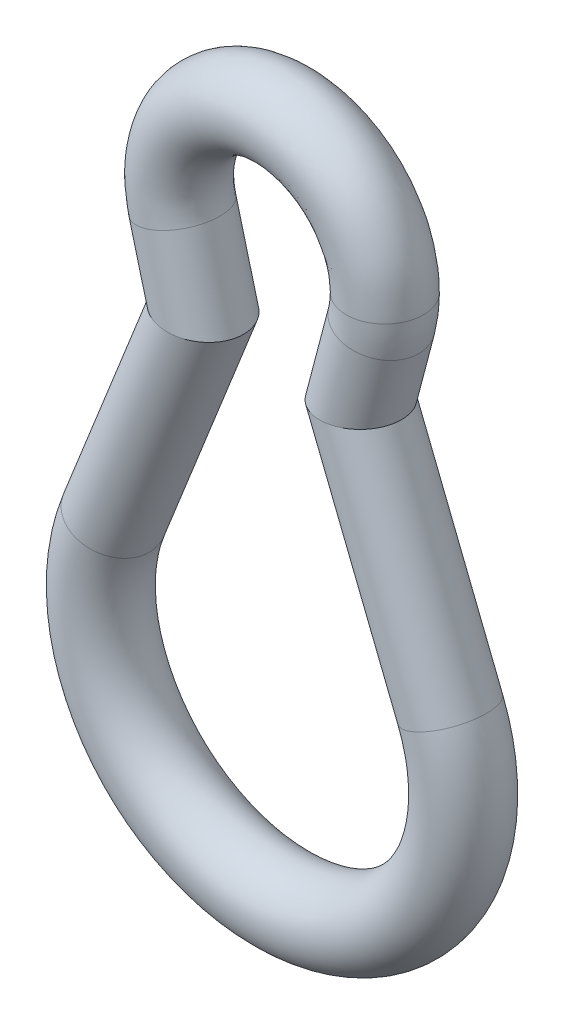
ISO-10303-21;
HEADER;
FILE_DESCRIPTION(('STEP AP214'),'2;1');
FILE_NAME('part.step','',(''),(''),'','','');
FILE_SCHEMA(('AUTOMOTIVE_DESIGN { 1 0 10303 214 1 1 1 1 }'));
ENDSEC;
DATA;
#1=APPLICATION_CONTEXT('core data for automotive mechanical design processes');
#2=APPLICATION_PROTOCOL_DEFINITION('international standard','automotive_design',2000,#1);
#3=PRODUCT_CONTEXT('',#1,'mechanical');
#4=PRODUCT('Part','Part','',(#3));
#5=PRODUCT_RELATED_PRODUCT_CATEGORY('part','',(#4));
#6=PRODUCT_DEFINITION_FORMATION('','',#4);
#7=PRODUCT_DEFINITION_CONTEXT('part definition',#1,'design');
#8=PRODUCT_DEFINITION('design','',#6,#7);
#9=PRODUCT_DEFINITION_SHAPE('','',#8);
#10=(LENGTH_UNIT() NAMED_UNIT(*) SI_UNIT(.MILLI.,.METRE.));
#11=(NAMED_UNIT(*) PLANE_ANGLE_UNIT() SI_UNIT($,.RADIAN.));
#12=(NAMED_UNIT(*) SI_UNIT($,.STERADIAN.) SOLID_ANGLE_UNIT());
#13=UNCERTAINTY_MEASURE_WITH_UNIT(LENGTH_MEASURE(1.E-05),#10,'distance_accuracy_value','');
#14=(GEOMETRIC_REPRESENTATION_CONTEXT(3) GLOBAL_UNCERTAINTY_ASSIGNED_CONTEXT((#13)) GLOBAL_UNIT_ASSIGNED_CONTEXT((#10,
#11,#12)) REPRESENTATION_CONTEXT('',''));
#15=CARTESIAN_POINT('',(0.,0.,0.));
#16=DIRECTION('',(0.,0.,1.));
#17=DIRECTION('',(1.,0.,0.));
#18=AXIS2_PLACEMENT_3D('',#15,#16,#17);
#19=CARTESIAN_POINT('',(-6.14173985435006,-8.10787334536775,0.));
#20=DIRECTION('',(-0.254043646292755,0.967192755234592,0.));
#21=DIRECTION('',(-0.967192755234592,-0.254043646292755,0.));
#22=AXIS2_PLACEMENT_3D('',#19,#20,#21);
#23=CYLINDRICAL_SURFACE('',#22,2.99999999999999);
#24=CARTESIAN_POINT('',(-6.14173985435006,-8.10787334536775,0.));
#25=DIRECTION('',(0.0612845891177254,0.99812033299431,0.));
#26=DIRECTION('',(0.99812033299431,-0.0612845891177254,0.));
#27=AXIS2_PLACEMENT_3D('',#24,#25,#26);
#28=ELLIPSE('',#27,3.15854042747548,2.99999999999999);
#29=CARTESIAN_POINT('',(-2.98913643110224,-8.30144319767731,0.));
#30=VERTEX_POINT('',#29);
#31=EDGE_CURVE('E50',#30,#30,#28,.F.);
#32=ORIENTED_EDGE('',*,*,#31,.F.);
#33=EDGE_LOOP('',(#32));
#34=FACE_BOUND('',#33,.T.);
#35=CARTESIAN_POINT('',(-7.73754204187673,-2.03234917034205,0.));
#36=DIRECTION('',(-0.254043646292756,0.967192755234592,0.));
#37=DIRECTION('',(-0.967192755234592,-0.254043646292756,0.));
#38=AXIS2_PLACEMENT_3D('',#35,#36,#37);
#39=CIRCLE('',#38,2.99999999999999);
#40=CARTESIAN_POINT('',(-10.6391203075805,-2.79448010922032,0.));
#41=VERTEX_POINT('',#40);
#42=EDGE_CURVE('E12',#41,#41,#39,.T.);
#43=ORIENTED_EDGE('',*,*,#42,.F.);
#44=EDGE_LOOP('',(#43));
#45=FACE_BOUND('',#44,.T.);
#46=ADVANCED_FACE('F43',(#34,#45),#23,.T.);
#47=CARTESIAN_POINT('',(-13.0901704085823,-25.5295312768433,0.));
#48=DIRECTION('',(0.370460562000954,0.92884819642498,0.));
#49=DIRECTION('',(-0.92884819642498,0.370460562000954,0.));
#50=AXIS2_PLACEMENT_3D('',#47,#48,#49);
#51=CYLINDRICAL_SURFACE('',#50,2.99999999999999);
#52=CARTESIAN_POINT('',(-13.0901704085823,-25.5295312768433,0.));
#53=DIRECTION('',(0.370460562000966,0.928848196424975,0.));
#54=DIRECTION('',(-0.928848196424975,0.370460562000966,0.));
#55=AXIS2_PLACEMENT_3D('',#52,#53,#54);
#56=CIRCLE('',#55,2.99999999999999);
#57=CARTESIAN_POINT('',(-15.8767149978572,-24.4181495908404,0.));
#58=VERTEX_POINT('',#57);
#59=EDGE_CURVE('E54',#58,#58,#56,.T.);
#60=ORIENTED_EDGE('',*,*,#59,.T.);
#61=EDGE_LOOP('',(#60));
#62=FACE_BOUND('',#61,.T.);
#63=ORIENTED_EDGE('',*,*,#31,.T.);
#64=EDGE_LOOP('',(#63));
#65=FACE_BOUND('',#64,.T.);
#66=ADVANCED_FACE('F87',(#62,#65),#51,.T.);
#67=CARTESIAN_POINT('',(0.,-30.750397188966,0.));
#68=DIRECTION('',(0.,0.,-1.));
#69=DIRECTION('',(-1.,0.,0.));
#70=AXIS2_PLACEMENT_3D('',#67,#68,#69);
#71=TOROIDAL_SURFACE('',#70,14.0929060948439,2.99999999999999);
#72=CARTESIAN_POINT('',(13.0901704085823,-25.5295312768434,0.));
#73=DIRECTION('',(0.370460562000954,-0.928848196424979,0.));
#74=DIRECTION('',(0.92884819642498,0.370460562000955,0.));
#75=AXIS2_PLACEMENT_3D('',#72,#73,#74);
#76=CIRCLE('',#75,2.99999999999999);
#77=CARTESIAN_POINT('',(15.8767149978573,-24.4181495908406,0.));
#78=VERTEX_POINT('',#77);
#79=EDGE_CURVE('E62',#78,#78,#76,.T.);
#80=CARTESIAN_POINT('',(0.,-30.750397188966,0.));
#81=DIRECTION('',(0.,0.,-1.));
#82=DIRECTION('',(-1.,0.,0.));
#83=AXIS2_PLACEMENT_3D('',#80,#81,#82);
#84=CIRCLE('',#83,17.0929060948439);
#85=EDGE_CURVE('',#78,#58,#84,.T.);
#86=ORIENTED_EDGE('',*,*,#79,.T.);
#87=ORIENTED_EDGE('',*,*,#59,.F.);
#88=ORIENTED_EDGE('',*,*,#85,.T.);
#89=ORIENTED_EDGE('',*,*,#85,.F.);
#90=EDGE_LOOP('',(#86,#88,#87,#89));
#91=FACE_BOUND('',#90,.T.);
#92=ADVANCED_FACE('F83',(#91),#71,.T.);
#93=CARTESIAN_POINT('',(8.,0.,3.));
#94=CARTESIAN_POINT('',(7.99576934543004,-0.191571782240596,3.));
#95=CARTESIAN_POINT('',(7.98729940645577,-0.575106121416609,3.));
#96=CARTESIAN_POINT('',(7.91401428206948,-1.25717786853266,3.));
#97=CARTESIAN_POINT('',(7.80445285110877,-1.73843700012841,3.));
#98=CARTESIAN_POINT('',(7.73754204187674,-2.03234917034203,3.));
#99=CARTESIAN_POINT('',(14.,0.,3.));
#100=CARTESIAN_POINT('',(13.9925456710518,-0.336516075520127,3.));
#101=CARTESIAN_POINT('',(13.9776218075594,-1.01023466359811,3.));
#102=CARTESIAN_POINT('',(13.8500647217087,-2.19733971152433,3.));
#103=CARTESIAN_POINT('',(13.6579971315021,-3.04123285039026,3.));
#104=CARTESIAN_POINT('',(13.5406985732843,-3.55661104809856,3.));
#105=CARTESIAN_POINT('',(14.,0.,-3.));
#106=CARTESIAN_POINT('',(13.9925456710518,-0.336516075520127,-3.));
#107=CARTESIAN_POINT('',(13.9776218075594,-1.01023466359811,-3.));
#108=CARTESIAN_POINT('',(13.8500647217087,-2.19733971152433,-3.));
#109=CARTESIAN_POINT('',(13.6579971315021,-3.04123285039026,-3.));
#110=CARTESIAN_POINT('',(13.5406985732843,-3.55661104809856,-3.));
#111=CARTESIAN_POINT('',(8.,0.,-3.));
#112=CARTESIAN_POINT('',(7.99576934543004,-0.191571782240596,-3.));
#113=CARTESIAN_POINT('',(7.98729940645577,-0.575106121416609,-3.));
#114=CARTESIAN_POINT('',(7.91401428206948,-1.25717786853266,-3.));
#115=CARTESIAN_POINT('',(7.80445285110877,-1.73843700012841,-3.));
#116=CARTESIAN_POINT('',(7.73754204187674,-2.03234917034203,-3.));
#117=CARTESIAN_POINT('',(2.,0.,-3.));
#118=CARTESIAN_POINT('',(1.9989930198083,-0.0466274889610644,-3.));
#119=CARTESIAN_POINT('',(1.99697700535215,-0.139977579235106,-3.));
#120=CARTESIAN_POINT('',(1.97796384243027,-0.317016025540995,-3.));
#121=CARTESIAN_POINT('',(1.95090857071545,-0.435641149866552,-3.));
#122=CARTESIAN_POINT('',(1.93438551046919,-0.508087292585508,-3.));
#123=CARTESIAN_POINT('',(2.,0.,3.));
#124=CARTESIAN_POINT('',(1.9989930198083,-0.0466274889610644,3.));
#125=CARTESIAN_POINT('',(1.99697700535215,-0.139977579235106,3.));
#126=CARTESIAN_POINT('',(1.97796384243027,-0.317016025540995,3.));
#127=CARTESIAN_POINT('',(1.95090857071545,-0.435641149866552,3.));
#128=CARTESIAN_POINT('',(1.93438551046919,-0.508087292585508,3.));
#129=CARTESIAN_POINT('',(8.,0.,3.));
#130=CARTESIAN_POINT('',(7.99576934543004,-0.191571782240596,3.));
#131=CARTESIAN_POINT('',(7.98729940645577,-0.575106121416609,3.));
#132=CARTESIAN_POINT('',(7.91401428206948,-1.25717786853266,3.));
#133=CARTESIAN_POINT('',(7.80445285110877,-1.73843700012841,3.));
#134=CARTESIAN_POINT('',(7.73754204187674,-2.03234917034203,3.));
#135=(BOUNDED_SURFACE() B_SPLINE_SURFACE(3,3,((#93,#94,#95,#96,#97,#98),(#99,#100,#101,#102,
#103,#104),(#105,#106,#107,#108,#109,#110),(#111,#112,#113,#114,#115,#116),(#117,#118,#119,#120,
#121,#122),(#123,#124,#125,#126,#127,#128),(#129,#130,#131,#132,#133,#134)),.UNSPECIFIED.,.T.,
.F.,.F.) B_SPLINE_SURFACE_WITH_KNOTS((4,3,4),(4,1,1,4),(0.,0.5,1.),(0.,0.27979447423529,
0.560159682839721,1.),
.UNSPECIFIED.) GEOMETRIC_REPRESENTATION_ITEM() RATIONAL_B_SPLINE_SURFACE(((1.,1.,1.,1.,1.,1.),
(0.333333333333333,0.333333333333333,0.333333333333333,0.333333333333333,0.333333333333333,
0.333333333333333),(0.333333333333333,0.333333333333333,0.333333333333333,0.333333333333333,
0.333333333333333,0.333333333333333),(1.,1.,1.,1.,1.,1.),(0.333333333333333,0.333333333333333,
0.333333333333333,0.333333333333333,0.333333333333333,0.333333333333333),(0.333333333333333,
0.333333333333333,0.333333333333333,0.333333333333333,0.333333333333333,0.333333333333333),(1.,
1.,1.,1.,1.,1.))) REPRESENTATION_ITEM('') SURFACE());
#136=CARTESIAN_POINT('',(8.,0.,0.));
#137=DIRECTION('',(0.,1.,0.));
#138=DIRECTION('',(0.,0.,1.));
#139=AXIS2_PLACEMENT_3D('',#136,#137,#138);
#140=CIRCLE('',#139,3.);
#141=CARTESIAN_POINT('',(8.,0.,3.));
#142=VERTEX_POINT('',#141);
#143=EDGE_CURVE('E46',#142,#142,#140,.T.);
#144=CARTESIAN_POINT('',(7.73754204187674,-2.03234917034203,0.));
#145=DIRECTION('',(-0.254043646292754,-0.967192755234592,0.));
#146=DIRECTION('',(0.967192755234592,-0.254043646292754,0.));
#147=AXIS2_PLACEMENT_3D('',#144,#145,#146);
#148=CIRCLE('',#147,3.);
#149=CARTESIAN_POINT('',(7.73754204187674,-2.03234917034203,3.));
#150=VERTEX_POINT('',#149);
#151=EDGE_CURVE('E59',#150,#150,#148,.T.);
#152=CARTESIAN_POINT('',(8.,0.,3.));
#153=CARTESIAN_POINT('',(7.99952748314478,-0.0213963860795901,3.));
#154=CARTESIAN_POINT('',(7.99905496745038,-0.0427927945937365,3.));
#155=CARTESIAN_POINT('',(7.99808728426188,-0.0855845929470334,3.));
#156=CARTESIAN_POINT('',(7.99759211729969,-0.106979982798306,3.));
#157=CARTESIAN_POINT('',(7.99655647996672,-0.149768752396872,3.));
#158=CARTESIAN_POINT('',(7.99601601157099,-0.17116213219113,3.));
#159=CARTESIAN_POINT('',(7.99486711816994,-0.213945870897133,3.));
#160=CARTESIAN_POINT('',(7.99425869703649,-0.235336229911532,3.));
#161=CARTESIAN_POINT('',(7.99295124365083,-0.278112921441149,3.));
#162=CARTESIAN_POINT('',(7.99225221685775,-0.299499254121278,3.));
#163=CARTESIAN_POINT('',(7.99074090250777,-0.342266885967468,3.));
#164=CARTESIAN_POINT('',(7.98992862061832,-0.363648185331808,3.));
#165=CARTESIAN_POINT('',(7.98816813136309,-0.406404743943111,3.));
#166=CARTESIAN_POINT('',(7.9872199271207,-0.427780003317563,3.));
#167=CARTESIAN_POINT('',(7.98516499380662,-0.470523475292146,3.));
#168=CARTESIAN_POINT('',(7.9840582608848,-0.491891687708493,3.));
#169=CARTESIAN_POINT('',(7.98166344314816,-0.534620059502849,3.));
#170=CARTESIAN_POINT('',(7.98037534109138,-0.555980217921398,3.));
#171=CARTESIAN_POINT('',(7.97759588010235,-0.598690781526215,3.));
#172=CARTESIAN_POINT('',(7.97610448860405,-0.620041184598771,3.));
#173=CARTESIAN_POINT('',(7.97291777521804,-0.662729562418091,3.));
#174=CARTESIAN_POINT('',(7.97122242674852,-0.68406753517986,3.));
#175=CARTESIAN_POINT('',(7.96762640517319,-0.726727883671611,3.));
#176=CARTESIAN_POINT('',(7.96572571579826,-0.748050258030791,3.));
#177=CARTESIAN_POINT('',(7.96171781817774,-0.790676240137919,3.));
#178=CARTESIAN_POINT('',(7.959610603717,-0.811979847301611,3.));
#179=CARTESIAN_POINT('',(7.95518840698376,-0.854565125296175,3.));
#180=CARTESIAN_POINT('',(7.95287342824865,-0.87584679649429,3.));
#181=CARTESIAN_POINT('',(7.94803447448539,-0.918385033271638,3.));
#182=CARTESIAN_POINT('',(7.94551051242974,-0.939641600326237,3.));
#183=CARTESIAN_POINT('',(7.94025233821337,-0.982126456970183,3.));
#184=CARTESIAN_POINT('',(7.93751814812475,-1.0033547492907,3.));
#185=CARTESIAN_POINT('',(7.9318383467911,-1.04577989351509,3.));
#186=CARTESIAN_POINT('',(7.92889276634837,-1.06697674954207,3.));
#187=CARTESIAN_POINT('',(7.92278870960143,-1.10933582459408,3.));
#188=CARTESIAN_POINT('',(7.91963027249681,-1.13049804926553,3.));
#189=CARTESIAN_POINT('',(7.91310006819659,-1.17278544085768,3.));
#190=CARTESIAN_POINT('',(7.90972834139429,-1.1939106140211,3.));
#191=CARTESIAN_POINT('',(7.90278753521719,-1.23612621520381,3.));
#192=CARTESIAN_POINT('',(7.89921847627611,-1.25721664658858,3.));
#193=CARTESIAN_POINT('',(7.8918980301257,-1.29936542133697,3.));
#194=CARTESIAN_POINT('',(7.88814664609641,-1.32042376525366,3.));
#195=CARTESIAN_POINT('',(7.8804768049235,-1.36251104640141,3.));
#196=CARTESIAN_POINT('',(7.87655833947122,-1.38353998211623,3.));
#197=CARTESIAN_POINT('',(7.86856952150621,-1.4255711207782,3.));
#198=CARTESIAN_POINT('',(7.86449915386836,-1.4465733208468,3.));
#199=CARTESIAN_POINT('',(7.85622173024995,-1.48855366323418,3.));
#200=CARTESIAN_POINT('',(7.8520146559893,-1.50953180194404,3.));
#201=CARTESIAN_POINT('',(7.84347900988013,-1.5514666955404,3.));
#202=CARTESIAN_POINT('',(7.8391504193424,-1.57242344661812,3.));
#203=CARTESIAN_POINT('',(7.83038693015217,-1.61431823850214,3.));
#204=CARTESIAN_POINT('',(7.82595201433389,-1.6352562757134,3.));
#205=CARTESIAN_POINT('',(7.81699106201671,-1.67711631298314,3.));
#206=CARTESIAN_POINT('',(7.81246501109396,-1.69803830995028,3.));
#207=CARTESIAN_POINT('',(7.80333697504567,-1.73986893963986,3.));
#208=CARTESIAN_POINT('',(7.79873497884236,-1.76077756994218,3.));
#209=CARTESIAN_POINT('',(7.78947023831527,-1.80258413890611,3.));
#210=CARTESIAN_POINT('',(7.78480748634776,-1.82348207587186,3.));
#211=CARTESIAN_POINT('',(7.77543642019051,-1.86526993133971,3.));
#212=CARTESIAN_POINT('',(7.77072810145941,-1.8861598488223,3.));
#213=CARTESIAN_POINT('',(7.76128108903281,-1.9279343363321,3.));
#214=CARTESIAN_POINT('',(7.75654239324238,-1.94881890588494,3.));
#215=CARTESIAN_POINT('',(7.74704981129956,-1.99058537705496,3.));
#216=CARTESIAN_POINT('',(7.74229592461187,-2.01146727855057,3.));
#217=CARTESIAN_POINT('',(7.73754204187674,-2.03234917034203,3.));
#218=B_SPLINE_CURVE_WITH_KNOTS('',3,(#152,#153,#154,#155,#156,#157,#158,#159,#160,#161,#162,
#163,#164,#165,#166,#167,#168,#169,#170,#171,#172,#173,#174,#175,#176,#177,#178,#179,#180,#181,
#182,#183,#184,#185,#186,#187,#188,#189,#190,#191,#192,#193,#194,#195,#196,#197,#198,#199,#200,
#201,#202,#203,#204,#205,#206,#207,#208,#209,#210,#211,#212,#213,#214,#215,#216,#217),
.UNSPECIFIED.,.F.,.F.,(4,2,2,2,2,2,2,2,2,2,2,2,2,2,2,2,2,2,2,2,2,2,2,2,2,2,2,2,2,2,2,2,4),(0.,
0.0642048466966653,0.128408186491537,0.192608728587863,0.256805614467788,0.320998634178404,
0.385188442722458,0.44937677646965,0.513566669402413,0.577762668708769,0.64196896403244,
0.706183636477938,0.770403400378218,0.834625097495786,0.898845701383067,0.963062321805551,
1.02727220922801,1.09147275936389,1.15566151849099,1.21983815758285,1.28400816358784,
1.3481770507666,1.41234913267445,1.47652762142062,1.54071472755707,1.60491176034822,
1.66911922822752,1.73333693929589,1.79756410176138,1.86179942425738,1.92604121601003,
1.99028748685241,2.05453604710486),.UNSPECIFIED.);
#219=EDGE_CURVE('BSEAM86',#142,#150,#218,.T.);
#220=ORIENTED_EDGE('',*,*,#143,.F.);
#221=ORIENTED_EDGE('',*,*,#151,.F.);
#222=ORIENTED_EDGE('',*,*,#219,.T.);
#223=ORIENTED_EDGE('',*,*,#219,.F.);
#224=EDGE_LOOP('',(#220,#222,#221,#223));
#225=FACE_BOUND('',#224,.T.);
#226=ADVANCED_FACE('F86',(#225),#135,.F.);
#227=CARTESIAN_POINT('',(10.6391203075805,-2.79448010922029,0.));
#228=CARTESIAN_POINT('',(9.29434327759788,-7.91430349305819,0.));
#229=CARTESIAN_POINT('',(10.6391203075805,-2.79448010922029,6.));
#230=CARTESIAN_POINT('',(9.29434327759788,-7.91430349305819,6.));
#231=CARTESIAN_POINT('',(4.83596377617296,-1.27021823146377,6.));
#232=CARTESIAN_POINT('',(2.98913643110224,-8.30144319767731,6.));
#233=CARTESIAN_POINT('',(4.83596377617296,-1.27021823146377,0.));
#234=CARTESIAN_POINT('',(2.98913643110224,-8.30144319767731,0.));
#235=CARTESIAN_POINT('',(4.83596377617296,-1.27021823146377,-6.));
#236=CARTESIAN_POINT('',(2.98913643110224,-8.30144319767731,-6.));
#237=CARTESIAN_POINT('',(10.6391203075805,-2.79448010922029,-6.));
#238=CARTESIAN_POINT('',(9.29434327759788,-7.91430349305819,-6.));
#239=CARTESIAN_POINT('',(10.6391203075805,-2.79448010922029,0.));
#240=CARTESIAN_POINT('',(9.29434327759788,-7.91430349305819,0.));
#241=(BOUNDED_SURFACE() B_SPLINE_SURFACE(3,1,((#227,#228),(#229,#230),(#231,#232),(#233,#234),
(#235,#236),(#237,#238),(#239,#240)),.UNSPECIFIED.,.T.,.F.,.F.) B_SPLINE_SURFACE_WITH_KNOTS((4,
3,4),(2,2),(0.,0.5,1.),(0.,1.),
.UNSPECIFIED.) GEOMETRIC_REPRESENTATION_ITEM() RATIONAL_B_SPLINE_SURFACE(((1.,1.),
(0.333333333333333,0.333333333333333),(0.333333333333333,0.333333333333333),(1.,1.),
(0.333333333333333,0.333333333333333),(0.333333333333333,0.333333333333333),(1.,1.))) REPRESENTATION_ITEM('') SURFACE());
#242=CARTESIAN_POINT('',(9.29434327759788,-7.91430349305819,0.));
#243=CARTESIAN_POINT('',(9.29434327759788,-7.91430349305819,-6.));
#244=CARTESIAN_POINT('',(2.98913643110224,-8.30144319767731,-6.));
#245=CARTESIAN_POINT('',(2.98913643110224,-8.30144319767731,0.));
#246=CARTESIAN_POINT('',(2.98913643110224,-8.30144319767731,6.));
#247=CARTESIAN_POINT('',(9.29434327759788,-7.91430349305819,6.));
#248=CARTESIAN_POINT('',(9.29434327759788,-7.91430349305819,0.));
#249=(BOUNDED_CURVE() B_SPLINE_CURVE(3,(#242,#243,#244,#245,#246,#247,#248),.UNSPECIFIED.,.T.,
.F.) B_SPLINE_CURVE_WITH_KNOTS((4,3,4),(0.,0.5,1.),
.UNSPECIFIED.) CURVE() GEOMETRIC_REPRESENTATION_ITEM() RATIONAL_B_SPLINE_CURVE((1.,
0.333333333333333,0.333333333333333,1.,0.333333333333333,0.333333333333333,1.)) REPRESENTATION_ITEM(''));
#250=CARTESIAN_POINT('',(9.29434327759788,-7.91430349305819,0.));
#251=VERTEX_POINT('',#250);
#252=EDGE_CURVE('E65',#251,#251,#249,.T.);
#253=ORIENTED_EDGE('',*,*,#151,.T.);
#254=EDGE_LOOP('',(#253));
#255=FACE_BOUND('',#254,.T.);
#256=ORIENTED_EDGE('',*,*,#252,.T.);
#257=EDGE_LOOP('',(#256));
#258=FACE_BOUND('',#257,.T.);
#259=ADVANCED_FACE('F74',(#255,#258),#241,.T.);
#260=CARTESIAN_POINT('',(9.29434327759788,-7.91430349305819,0.));
#261=CARTESIAN_POINT('',(15.8767149978573,-24.4181495908406,0.));
#262=CARTESIAN_POINT('',(9.29434327759788,-7.91430349305819,-6.));
#263=CARTESIAN_POINT('',(15.8767149978573,-24.4181495908406,-6.));
#264=CARTESIAN_POINT('',(2.98913643110224,-8.30144319767731,-6.));
#265=CARTESIAN_POINT('',(10.3036258193074,-26.6409129628463,-6.));
#266=CARTESIAN_POINT('',(2.98913643110224,-8.30144319767731,0.));
#267=CARTESIAN_POINT('',(10.3036258193074,-26.6409129628463,0.));
#268=CARTESIAN_POINT('',(2.98913643110224,-8.30144319767731,6.));
#269=CARTESIAN_POINT('',(10.3036258193074,-26.6409129628463,6.));
#270=CARTESIAN_POINT('',(9.29434327759788,-7.91430349305819,6.));
#271=CARTESIAN_POINT('',(15.8767149978573,-24.4181495908406,6.));
#272=CARTESIAN_POINT('',(9.29434327759788,-7.91430349305819,0.));
#273=CARTESIAN_POINT('',(15.8767149978573,-24.4181495908406,0.));
#274=(BOUNDED_SURFACE() B_SPLINE_SURFACE(3,1,((#260,#261),(#262,#263),(#264,#265),(#266,#267),
(#268,#269),(#270,#271),(#272,#273)),.UNSPECIFIED.,.T.,.F.,.F.) B_SPLINE_SURFACE_WITH_KNOTS((4,
3,4),(2,2),(0.,0.5,1.),(0.,1.),
.UNSPECIFIED.) GEOMETRIC_REPRESENTATION_ITEM() RATIONAL_B_SPLINE_SURFACE(((1.,1.),
(0.333333333333333,0.333333333333333),(0.333333333333333,0.333333333333333),(1.,1.),
(0.333333333333333,0.333333333333333),(0.333333333333333,0.333333333333333),(1.,1.))) REPRESENTATION_ITEM('') SURFACE());
#275=ORIENTED_EDGE('',*,*,#252,.F.);
#276=EDGE_LOOP('',(#275));
#277=FACE_BOUND('',#276,.T.);
#278=ORIENTED_EDGE('',*,*,#79,.F.);
#279=EDGE_LOOP('',(#278));
#280=FACE_BOUND('',#279,.T.);
#281=ADVANCED_FACE('F76',(#277,#280),#274,.F.);
#282=CARTESIAN_POINT('',(-10.6391203075805,-2.79448010922032,0.));
#283=CARTESIAN_POINT('',(-10.7714495268382,-2.2906774594015,0.));
#284=CARTESIAN_POINT('',(-11.0799362628457,-0.534544113675141,0.));
#285=CARTESIAN_POINT('',(-10.9522678868714,1.64473386562456,0.));
#286=CARTESIAN_POINT('',(-10.3408400587289,4.01039870317369,0.));
#287=CARTESIAN_POINT('',(-9.20215965959337,6.19641542061183,0.));
#288=CARTESIAN_POINT('',(-7.59501044118968,8.07710551345784,0.));
#289=CARTESIAN_POINT('',(-5.66834866636529,9.52746128129416,0.));
#290=CARTESIAN_POINT('',(-3.57220550126056,10.4810715990348,0.));
#291=CARTESIAN_POINT('',(-1.41799040006387,10.9802409259085,0.));
#292=CARTESIAN_POINT('',(0.792361634951478,11.0447126285293,0.));
#293=CARTESIAN_POINT('',(3.06199476043726,10.6548994907085,0.));
#294=CARTESIAN_POINT('',(5.29390173851977,9.74158208199315,0.));
#295=CARTESIAN_POINT('',(7.32610218787386,8.33087829693083,0.));
#296=CARTESIAN_POINT('',(8.98276927820027,6.50585328556144,0.));
#297=CARTESIAN_POINT('',(10.175119965166,4.37312874827687,0.));
#298=CARTESIAN_POINT('',(10.8522316176277,2.29778021480471,0.));
#299=CARTESIAN_POINT('',(11.,0.520891670344052,0.));
#300=CARTESIAN_POINT('',(11.,0.,0.));
#301=CARTESIAN_POINT('',(-10.6391203075805,-2.79448010922032,5.99999999999999));
#302=CARTESIAN_POINT('',(-10.6226274655256,-2.85727151369569,5.99999999999999));
#303=CARTESIAN_POINT('',(-11.1537933424459,-0.253356081221878,5.99999999999999));
#304=CARTESIAN_POINT('',(-10.9307962065479,1.562987060226,5.99999999999999));
#305=CARTESIAN_POINT('',(-10.3468726109012,4.0333658278112,5.99999999999999));
#306=CARTESIAN_POINT('',(-9.20052531497511,6.19019298742444,5.99999999999999));
#307=CARTESIAN_POINT('',(-7.59543757188993,8.07873231144688,5.99999999999999));
#308=CARTESIAN_POINT('',(-5.66824121183833,9.52704994002753,5.99999999999999));
#309=CARTESIAN_POINT('',(-3.57223167911203,10.4811789727174,5.99999999999999));
#310=CARTESIAN_POINT('',(-1.41798359866522,10.9801882591233,5.99999999999999));
#311=CARTESIAN_POINT('',(0.792359676377915,11.0448231298941,5.99999999999999));
#312=CARTESIAN_POINT('',(3.06199532983252,10.6544743462756,5.99999999999999));
#313=CARTESIAN_POINT('',(5.29390157854568,9.74326401906291,5.99999999999999));
#314=CARTESIAN_POINT('',(7.32610223121525,8.32444480976592,5.99999999999999));
#315=CARTESIAN_POINT('',(8.98276926686919,6.52959945366973,5.99999999999999));
#316=CARTESIAN_POINT('',(10.1751199680307,4.2886090863704,5.99999999999999));
#317=CARTESIAN_POINT('',(10.8522316168816,2.58850616445836,5.99999999999999));
#318=CARTESIAN_POINT('',(11.,-0.0649212932329472,5.99999999999999));
#319=CARTESIAN_POINT('',(11.,0.,5.99999999999999));
#320=CARTESIAN_POINT('',(-4.83596377617296,-1.27021823146378,5.99999999999999));
#321=CARTESIAN_POINT('',(-4.81947093411802,-1.33300963593916,5.99999999999999));
#322=CARTESIAN_POINT('',(-5.07313626871793,-0.0975156208128082,5.99999999999999));
#323=CARTESIAN_POINT('',(-4.96813089863461,0.705479888630467,5.99999999999999));
#324=CARTESIAN_POINT('',(-4.70114773338107,1.83410273072295,5.99999999999999));
#325=CARTESIAN_POINT('',(-4.18292245626764,2.81399667592863,5.99999999999999));
#326=CARTESIAN_POINT('',(-3.45102696961316,3.67031901931543,5.99999999999999));
#327=CARTESIAN_POINT('',(-2.57678672362152,4.33128116353005,5.99999999999999));
#328=CARTESIAN_POINT('',(-1.62383723867057,4.76279666402363,5.99999999999999));
#329=CARTESIAN_POINT('',(-0.644621716594013,4.99164292929304,5.99999999999999));
#330=CARTESIAN_POINT('',(0.360605381838082,5.01906796119738,5.99999999999999));
#331=CARTESIAN_POINT('',(1.39191499096925,4.84380005723812,5.99999999999999));
#332=CARTESIAN_POINT('',(2.40538705640434,4.42661743969675,5.99999999999999));
#333=CARTESIAN_POINT('',(3.33081431920161,3.78432207116247,5.99999999999999));
#334=CARTESIAN_POINT('',(4.08097388362534,2.96822758546025,5.99999999999999));
#335=CARTESIAN_POINT('',(4.62591752892263,1.94445712599592,5.99999999999999));
#336=CARTESIAN_POINT('',(4.93147386930361,1.19448163387278,5.99999999999999));
#337=CARTESIAN_POINT('',(5.,-0.0649212932329472,5.99999999999999));
#338=CARTESIAN_POINT('',(5.,0.,5.99999999999999));
#339=CARTESIAN_POINT('',(-4.83596377617296,-1.27021823146378,0.));
#340=CARTESIAN_POINT('',(-4.89388196477435,-1.04971260879206,0.));
#341=CARTESIAN_POINT('',(-5.03620772891779,-0.23810963703944,0.));
#342=CARTESIAN_POINT('',(-4.97886673879636,0.746353291329747,0.));
#343=CARTESIAN_POINT('',(-4.69813145729488,1.8226191684042,0.));
#344=CARTESIAN_POINT('',(-4.18373962857678,2.81710789252233,0.));
#345=CARTESIAN_POINT('',(-3.45081340426304,3.66950562032091,0.));
#346=CARTESIAN_POINT('',(-2.576840450885,4.33148683416337,0.));
#347=CARTESIAN_POINT('',(-1.62382414974484,4.76274297718232,0.));
#348=CARTESIAN_POINT('',(-0.644625117293337,4.99166926268563,0.));
#349=CARTESIAN_POINT('',(0.360606361124863,5.01901271051498,0.));
#350=CARTESIAN_POINT('',(1.39191470627162,4.84401262945455,0.));
#351=CARTESIAN_POINT('',(2.40538713639139,4.42577647116187,0.));
#352=CARTESIAN_POINT('',(3.33081429753091,3.78753881474492,0.));
#353=CARTESIAN_POINT('',(4.08097388929088,2.95635450140611,0.));
#354=CARTESIAN_POINT('',(4.62591752749032,1.98671695694915,0.));
#355=CARTESIAN_POINT('',(4.93147386967668,1.04911865904596,0.));
#356=CARTESIAN_POINT('',(5.,0.227985188555552,0.));
#357=CARTESIAN_POINT('',(5.,0.,0.));
#358=CARTESIAN_POINT('',(-4.83596377617296,-1.27021823146378,-5.99999999999999));
#359=CARTESIAN_POINT('',(-4.96829299543069,-0.766415581644968,-5.99999999999999));
#360=CARTESIAN_POINT('',(-4.99927918911764,-0.378703653266071,-5.99999999999999));
#361=CARTESIAN_POINT('',(-4.98960257895812,0.787226694029028,-5.99999999999999));
#362=CARTESIAN_POINT('',(-4.69511518120869,1.81113560608545,-5.99999999999999));
#363=CARTESIAN_POINT('',(-4.18455680088591,2.82021910911603,-5.99999999999999));
#364=CARTESIAN_POINT('',(-3.45059983891291,3.66869222132639,-5.99999999999999));
#365=CARTESIAN_POINT('',(-2.57689417814848,4.33169250479669,-5.99999999999999));
#366=CARTESIAN_POINT('',(-1.6238110608191,4.762689290341,-5.99999999999999));
#367=CARTESIAN_POINT('',(-0.644628517992662,4.99169559607822,-5.99999999999999));
#368=CARTESIAN_POINT('',(0.360607340411644,5.01895745983259,-5.99999999999999));
#369=CARTESIAN_POINT('',(1.391914421574,4.84422520167098,-5.99999999999999));
#370=CARTESIAN_POINT('',(2.40538721637843,4.42493550262699,-5.99999999999999));
#371=CARTESIAN_POINT('',(3.33081427586021,3.79075555832737,-5.99999999999999));
#372=CARTESIAN_POINT('',(4.08097389495642,2.94448141735197,-5.99999999999999));
#373=CARTESIAN_POINT('',(4.62591752605801,2.02897678790239,-5.99999999999999));
#374=CARTESIAN_POINT('',(4.93147387004974,0.903755684219137,-5.99999999999999));
#375=CARTESIAN_POINT('',(5.,0.520891670344052,-5.99999999999999));
#376=CARTESIAN_POINT('',(5.,0.,-5.99999999999999));
#377=CARTESIAN_POINT('',(-10.6391203075805,-2.79448010922032,-5.99999999999999));
#378=CARTESIAN_POINT('',(-10.9202715881509,-1.72408340510731,-5.99999999999999));
#379=CARTESIAN_POINT('',(-11.0060791832454,-0.815732146128404,-5.99999999999999));
#380=CARTESIAN_POINT('',(-10.9737395671949,1.72648067102312,-5.99999999999999));
#381=CARTESIAN_POINT('',(-10.3348075065565,3.98743157853618,-5.99999999999999));
#382=CARTESIAN_POINT('',(-9.20379400421164,6.20263785379923,-5.99999999999999));
#383=CARTESIAN_POINT('',(-7.59458331048942,8.0754787154688,-5.99999999999999));
#384=CARTESIAN_POINT('',(-5.66845612089225,9.5278726225608,-5.99999999999999));
#385=CARTESIAN_POINT('',(-3.57217932340909,10.4809642253521,-5.99999999999999));
#386=CARTESIAN_POINT('',(-1.41799720146251,10.9802935926937,-5.99999999999999));
#387=CARTESIAN_POINT('',(0.792363593525041,11.0446021271645,-5.99999999999999));
#388=CARTESIAN_POINT('',(3.06199419104201,10.6553246351413,-5.99999999999999));
#389=CARTESIAN_POINT('',(5.29390189849386,9.73990014492339,-5.99999999999999));
#390=CARTESIAN_POINT('',(7.32610214453246,8.33731178409573,-5.99999999999999));
#391=CARTESIAN_POINT('',(8.98276928953134,6.48210711745315,-5.99999999999999));
#392=CARTESIAN_POINT('',(10.1751199623014,4.45764841018335,-5.99999999999999));
#393=CARTESIAN_POINT('',(10.8522316183739,2.00705426515107,-5.99999999999999));
#394=CARTESIAN_POINT('',(11.,1.10670463392105,-5.99999999999999));
#395=CARTESIAN_POINT('',(11.,0.,-5.99999999999999));
#396=CARTESIAN_POINT('',(-10.6391203075805,-2.79448010922032,0.));
#397=CARTESIAN_POINT('',(-10.7714495268382,-2.2906774594015,0.));
#398=CARTESIAN_POINT('',(-11.0799362628457,-0.534544113675141,0.));
#399=CARTESIAN_POINT('',(-10.9522678868714,1.64473386562456,0.));
#400=CARTESIAN_POINT('',(-10.3408400587289,4.01039870317369,0.));
#401=CARTESIAN_POINT('',(-9.20215965959337,6.19641542061183,0.));
#402=CARTESIAN_POINT('',(-7.59501044118968,8.07710551345784,0.));
#403=CARTESIAN_POINT('',(-5.66834866636529,9.52746128129416,0.));
#404=CARTESIAN_POINT('',(-3.57220550126056,10.4810715990348,0.));
#405=CARTESIAN_POINT('',(-1.41799040006387,10.9802409259085,0.));
#406=CARTESIAN_POINT('',(0.792361634951478,11.0447126285293,0.));
#407=CARTESIAN_POINT('',(3.06199476043726,10.6548994907085,0.));
#408=CARTESIAN_POINT('',(5.29390173851977,9.74158208199315,0.));
#409=CARTESIAN_POINT('',(7.32610218787386,8.33087829693083,0.));
#410=CARTESIAN_POINT('',(8.98276927820027,6.50585328556144,0.));
#411=CARTESIAN_POINT('',(10.175119965166,4.37312874827687,0.));
#412=CARTESIAN_POINT('',(10.8522316176277,2.29778021480471,0.));
#413=CARTESIAN_POINT('',(11.,0.520891670344052,0.));
#414=CARTESIAN_POINT('',(11.,0.,0.));
#415=(BOUNDED_SURFACE() B_SPLINE_SURFACE(3,3,((#282,#283,#284,#285,#286,#287,#288,#289,#290,
#291,#292,#293,#294,#295,#296,#297,#298,#299,#300),(#301,#302,#303,#304,#305,#306,#307,#308,
#309,#310,#311,#312,#313,#314,#315,#316,#317,#318,#319),(#320,#321,#322,#323,#324,#325,#326,
#327,#328,#329,#330,#331,#332,#333,#334,#335,#336,#337,#338),(#339,#340,#341,#342,#343,#344,
#345,#346,#347,#348,#349,#350,#351,#352,#353,#354,#355,#356,#357),(#358,#359,#360,#361,#362,
#363,#364,#365,#366,#367,#368,#369,#370,#371,#372,#373,#374,#375,#376),(#377,#378,#379,#380,
#381,#382,#383,#384,#385,#386,#387,#388,#389,#390,#391,#392,#393,#394,#395),(#396,#397,#398,
#399,#400,#401,#402,#403,#404,#405,#406,#407,#408,#409,#410,#411,#412,#413,#414)),.UNSPECIFIED.,
.T.,.F.,.F.) B_SPLINE_SURFACE_WITH_KNOTS((4,3,4),(4,1,1,1,1,1,1,1,1,1,1,1,1,1,1,1,4),(0.,0.5,
1.),(0.,0.0575915662324631,0.119124085320116,0.183774969751589,0.250000000000001,
0.316225030248413,0.380875914679887,0.442408433767538,0.499999999999874,0.557591566232343,
0.619124085320116,0.683774969751589,0.75,0.816225030248413,0.880875914679886,0.942408433767537,
1.),.UNSPECIFIED.) GEOMETRIC_REPRESENTATION_ITEM() RATIONAL_B_SPLINE_SURFACE(((1.,1.,1.,1.,1.,
1.,1.,1.,1.,1.,1.,1.,1.,1.,1.,1.,1.,1.,1.),(0.333333333333333,0.333333333333333,
0.333333333333333,0.333333333333333,0.333333333333334,0.333333333333333,0.333333333333333,
0.333333333333333,0.333333333333333,0.333333333333333,0.333333333333333,0.333333333333333,
0.333333333333333,0.333333333333333,0.333333333333333,0.333333333333333,0.333333333333333,
0.333333333333333,0.333333333333333),(0.333333333333333,0.333333333333333,0.333333333333333,
0.333333333333333,0.333333333333334,0.333333333333333,0.333333333333333,0.333333333333333,
0.333333333333333,0.333333333333333,0.333333333333333,0.333333333333333,0.333333333333333,
0.333333333333333,0.333333333333333,0.333333333333333,0.333333333333333,0.333333333333333,
0.333333333333333),(1.,1.,1.,1.,1.,1.,1.,1.,1.,1.,1.,1.,1.,1.,1.,1.,1.,1.,1.),
(0.333333333333333,0.333333333333333,0.333333333333333,0.333333333333333,0.333333333333334,
0.333333333333333,0.333333333333333,0.333333333333333,0.333333333333333,0.333333333333333,
0.333333333333333,0.333333333333333,0.333333333333333,0.333333333333333,0.333333333333333,
0.333333333333333,0.333333333333333,0.333333333333333,0.333333333333333),(0.333333333333333,
0.333333333333333,0.333333333333333,0.333333333333333,0.333333333333334,0.333333333333333,
0.333333333333333,0.333333333333333,0.333333333333333,0.333333333333333,0.333333333333333,
0.333333333333333,0.333333333333333,0.333333333333333,0.333333333333333,0.333333333333333,
0.333333333333333,0.333333333333333,0.333333333333333),(1.,1.,1.,1.,1.,1.,1.,1.,1.,1.,1.,1.,1.,
1.,1.,1.,1.,1.,1.))) REPRESENTATION_ITEM('') SURFACE());
#416=ORIENTED_EDGE('',*,*,#42,.T.);
#417=EDGE_LOOP('',(#416));
#418=FACE_BOUND('',#417,.T.);
#419=ORIENTED_EDGE('',*,*,#143,.T.);
#420=EDGE_LOOP('',(#419));
#421=FACE_BOUND('',#420,.T.);
#422=ADVANCED_FACE('F79',(#418,#421),#415,.T.);
#423=CLOSED_SHELL('',(#46,#66,#92,#226,#259,#281,#422));
#424=MANIFOLD_SOLID_BREP('B2',#423);
#425=ADVANCED_BREP_SHAPE_REPRESENTATION('',(#18,#424),#14);
#426=SHAPE_DEFINITION_REPRESENTATION(#9,#425);
ENDSEC;
END-ISO-10303-21;
